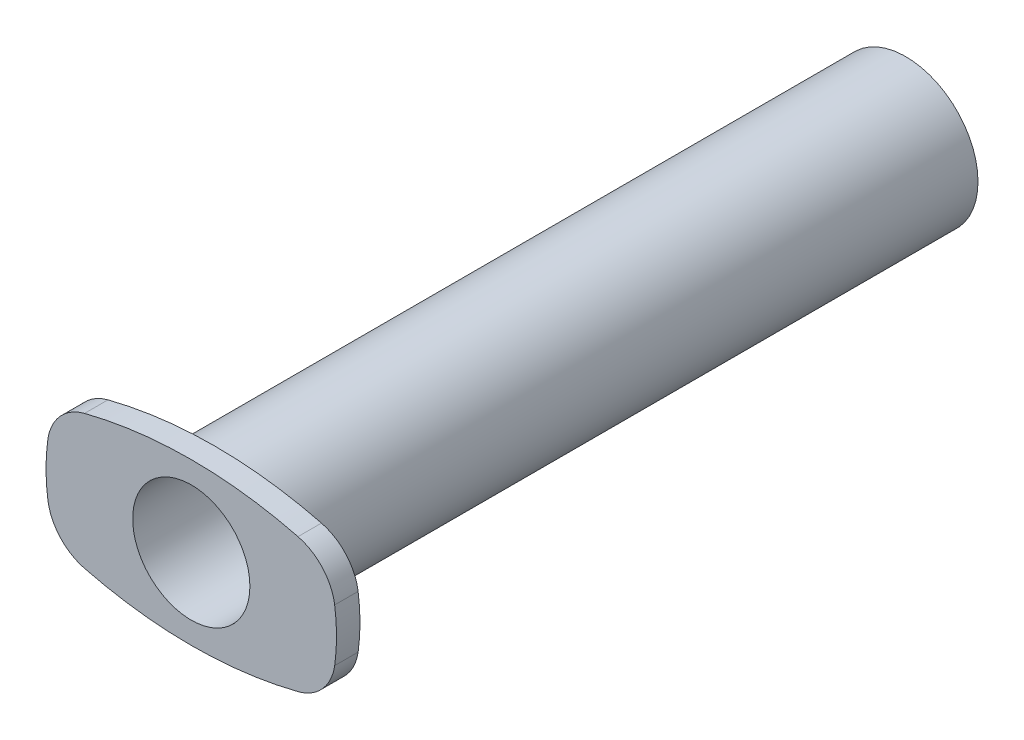
ISO-10303-21;
HEADER;
FILE_DESCRIPTION(('STEP AP214'),'2;1');
FILE_NAME('part.step','',(''),(''),'','','');
FILE_SCHEMA(('AUTOMOTIVE_DESIGN { 1 0 10303 214 1 1 1 1 }'));
ENDSEC;
DATA;
#1=APPLICATION_CONTEXT('core data for automotive mechanical design processes');
#2=APPLICATION_PROTOCOL_DEFINITION('international standard','automotive_design',2000,#1);
#3=PRODUCT_CONTEXT('',#1,'mechanical');
#4=PRODUCT('Part','Part','',(#3));
#5=PRODUCT_RELATED_PRODUCT_CATEGORY('part','',(#4));
#6=PRODUCT_DEFINITION_FORMATION('','',#4);
#7=PRODUCT_DEFINITION_CONTEXT('part definition',#1,'design');
#8=PRODUCT_DEFINITION('design','',#6,#7);
#9=PRODUCT_DEFINITION_SHAPE('','',#8);
#10=(LENGTH_UNIT() NAMED_UNIT(*) SI_UNIT(.MILLI.,.METRE.));
#11=(NAMED_UNIT(*) PLANE_ANGLE_UNIT() SI_UNIT($,.RADIAN.));
#12=(NAMED_UNIT(*) SI_UNIT($,.STERADIAN.) SOLID_ANGLE_UNIT());
#13=UNCERTAINTY_MEASURE_WITH_UNIT(LENGTH_MEASURE(1.E-05),#10,'distance_accuracy_value','');
#14=(GEOMETRIC_REPRESENTATION_CONTEXT(3) GLOBAL_UNCERTAINTY_ASSIGNED_CONTEXT((#13)) GLOBAL_UNIT_ASSIGNED_CONTEXT((#10,
#11,#12)) REPRESENTATION_CONTEXT('',''));
#15=CARTESIAN_POINT('',(0.,0.,0.));
#16=DIRECTION('',(0.,0.,1.));
#17=DIRECTION('',(1.,0.,0.));
#18=AXIS2_PLACEMENT_3D('',#15,#16,#17);
#19=CARTESIAN_POINT('',(0.,0.,-56.));
#20=DIRECTION('',(0.,0.,1.));
#21=DIRECTION('',(1.,0.,0.));
#22=AXIS2_PLACEMENT_3D('',#19,#20,#21);
#23=PLANE('',#22);
#24=CARTESIAN_POINT('',(0.,0.,-56.));
#25=DIRECTION('',(0.,0.,1.));
#26=DIRECTION('',(1.,0.,0.));
#27=AXIS2_PLACEMENT_3D('',#24,#25,#26);
#28=CIRCLE('',#27,4.75);
#29=CARTESIAN_POINT('',(4.75,0.,-56.));
#30=VERTEX_POINT('',#29);
#31=EDGE_CURVE('E18',#30,#30,#28,.T.);
#32=ORIENTED_EDGE('',*,*,#31,.T.);
#33=EDGE_LOOP('',(#32));
#34=FACE_BOUND('',#33,.T.);
#35=CARTESIAN_POINT('',(0.,0.,-56.));
#36=DIRECTION('',(0.,0.,1.));
#37=DIRECTION('',(1.,0.,0.));
#38=AXIS2_PLACEMENT_3D('',#35,#36,#37);
#39=CIRCLE('',#38,5.85);
#40=CARTESIAN_POINT('',(5.85,0.,-56.));
#41=VERTEX_POINT('',#40);
#42=EDGE_CURVE('E44',#41,#41,#39,.T.);
#43=ORIENTED_EDGE('',*,*,#42,.F.);
#44=EDGE_LOOP('',(#43));
#45=FACE_BOUND('',#44,.T.);
#46=ADVANCED_FACE('F15',(#34,#45),#23,.F.);
#47=CARTESIAN_POINT('',(0.,0.,0.));
#48=DIRECTION('',(0.,0.,-1.));
#49=DIRECTION('',(1.,0.,0.));
#50=AXIS2_PLACEMENT_3D('',#47,#48,#49);
#51=CYLINDRICAL_SURFACE('',#50,4.75);
#52=ORIENTED_EDGE('',*,*,#31,.F.);
#53=CARTESIAN_POINT('',(4.75,0.,1.9));
#54=CARTESIAN_POINT('',(4.75,0.,-56.));
#55=(BOUNDED_CURVE() B_SPLINE_CURVE(1,(#53,#54),.UNSPECIFIED.,.F.,
.F.) B_SPLINE_CURVE_WITH_KNOTS((2,2),(-1.9,56.),
.UNSPECIFIED.) CURVE() GEOMETRIC_REPRESENTATION_ITEM() RATIONAL_B_SPLINE_CURVE((1.,1.)) REPRESENTATION_ITEM(''));
#56=CARTESIAN_POINT('',(4.75,0.,1.9));
#57=VERTEX_POINT('',#56);
#58=EDGE_CURVE('E10',#57,#30,#55,.T.);
#59=ORIENTED_EDGE('',*,*,#58,.F.);
#60=CARTESIAN_POINT('',(0.,0.,1.9));
#61=DIRECTION('',(0.,0.,1.));
#62=DIRECTION('',(1.,0.,0.));
#63=AXIS2_PLACEMENT_3D('',#60,#61,#62);
#64=CIRCLE('',#63,4.75);
#65=EDGE_CURVE('E157',#57,#57,#64,.T.);
#66=ORIENTED_EDGE('',*,*,#65,.T.);
#67=ORIENTED_EDGE('',*,*,#58,.T.);
#68=EDGE_LOOP('',(#52,#59,#66,#67));
#69=FACE_BOUND('',#68,.T.);
#70=ADVANCED_FACE('F213',(#69),#51,.F.);
#71=CARTESIAN_POINT('',(0.,0.,0.));
#72=DIRECTION('',(0.,0.,1.));
#73=DIRECTION('',(1.,0.,0.));
#74=AXIS2_PLACEMENT_3D('',#71,#72,#73);
#75=CYLINDRICAL_SURFACE('',#74,5.85);
#76=DIRECTION('',(0.,0.,-1.));
#77=VECTOR('',#76,1.);
#78=CARTESIAN_POINT('',(5.85,0.,0.));
#79=LINE('',#78,#77);
#80=CARTESIAN_POINT('',(5.85,0.,0.));
#81=VERTEX_POINT('',#80);
#82=EDGE_CURVE('E130',#81,#41,#79,.T.);
#83=ORIENTED_EDGE('',*,*,#82,.T.);
#84=ORIENTED_EDGE('',*,*,#42,.T.);
#85=ORIENTED_EDGE('',*,*,#82,.F.);
#86=CARTESIAN_POINT('',(0.,0.,0.));
#87=DIRECTION('',(0.,0.,1.));
#88=DIRECTION('',(1.,0.,0.));
#89=AXIS2_PLACEMENT_3D('',#86,#87,#88);
#90=CIRCLE('',#89,5.85);
#91=EDGE_CURVE('E332',#81,#81,#90,.T.);
#92=ORIENTED_EDGE('',*,*,#91,.F.);
#93=EDGE_LOOP('',(#83,#84,#85,#92));
#94=FACE_BOUND('',#93,.T.);
#95=ADVANCED_FACE('F235',(#94),#75,.T.);
#96=CARTESIAN_POINT('',(0.,28.476495451672,0.));
#97=DIRECTION('',(0.,0.,-1.));
#98=DIRECTION('',(1.,0.,0.));
#99=AXIS2_PLACEMENT_3D('',#96,#97,#98);
#100=CYLINDRICAL_SURFACE('',#99,35.);
#101=CARTESIAN_POINT('',(8.648912649963,-5.438048773089,-0.11628));
#102=CARTESIAN_POINT('',(8.648912649963,-5.438048773089,-0.05814));
#103=CARTESIAN_POINT('',(8.648912649963,-5.438048773089,0.95));
#104=CARTESIAN_POINT('',(8.648912649963,-5.438048773089,1.95814));
#105=CARTESIAN_POINT('',(8.648912649963,-5.438048773089,2.01628));
#106=(BOUNDED_CURVE() B_SPLINE_CURVE(2,(#101,#102,#103,#104,#105),.UNSPECIFIED.,.F.,
.F.) B_SPLINE_CURVE_WITH_KNOTS((3,1,1,3),(-0.11628,0.,1.9,2.01628),
.UNSPECIFIED.) CURVE() GEOMETRIC_REPRESENTATION_ITEM() RATIONAL_B_SPLINE_CURVE((1.,1.,1.,1.,1.)) REPRESENTATION_ITEM(''));
#107=CARTESIAN_POINT('',(8.648912649963,-5.438048773089,0.));
#108=VERTEX_POINT('',#107);
#109=CARTESIAN_POINT('',(8.648912649963,-5.438048773089,1.9));
#110=VERTEX_POINT('',#109);
#111=EDGE_CURVE('E131',#108,#110,#106,.T.);
#112=ORIENTED_EDGE('',*,*,#111,.T.);
#113=CARTESIAN_POINT('',(0.,28.476495451672,1.9));
#114=DIRECTION('',(0.,0.,1.));
#115=DIRECTION('',(1.,0.,0.));
#116=AXIS2_PLACEMENT_3D('',#113,#114,#115);
#117=CIRCLE('',#116,35.);
#118=CARTESIAN_POINT('',(-8.648912649963,-5.438048773089,1.9));
#119=VERTEX_POINT('',#118);
#120=EDGE_CURVE('E134',#119,#110,#117,.T.);
#121=ORIENTED_EDGE('',*,*,#120,.F.);
#122=CARTESIAN_POINT('',(-8.648912649963,-5.438048773089,-0.11628));
#123=CARTESIAN_POINT('',(-8.648912649963,-5.438048773089,-0.05814));
#124=CARTESIAN_POINT('',(-8.648912649963,-5.438048773089,0.95));
#125=CARTESIAN_POINT('',(-8.648912649963,-5.438048773089,1.95814));
#126=CARTESIAN_POINT('',(-8.648912649963,-5.438048773089,2.01628));
#127=(BOUNDED_CURVE() B_SPLINE_CURVE(2,(#122,#123,#124,#125,#126),.UNSPECIFIED.,.F.,
.F.) B_SPLINE_CURVE_WITH_KNOTS((3,1,1,3),(-0.11628,0.,1.9,2.01628),
.UNSPECIFIED.) CURVE() GEOMETRIC_REPRESENTATION_ITEM() RATIONAL_B_SPLINE_CURVE((1.,1.,1.,1.,1.)) REPRESENTATION_ITEM(''));
#128=CARTESIAN_POINT('',(-8.648912649963,-5.438048773089,0.));
#129=VERTEX_POINT('',#128);
#130=EDGE_CURVE('E118',#129,#119,#127,.T.);
#131=ORIENTED_EDGE('',*,*,#130,.F.);
#132=CARTESIAN_POINT('',(0.,28.476495451672,0.));
#133=DIRECTION('',(0.,0.,1.));
#134=DIRECTION('',(1.,0.,0.));
#135=AXIS2_PLACEMENT_3D('',#132,#133,#134);
#136=CIRCLE('',#135,35.);
#137=EDGE_CURVE('E324',#129,#108,#136,.T.);
#138=ORIENTED_EDGE('',*,*,#137,.T.);
#139=EDGE_LOOP('',(#112,#121,#131,#138));
#140=FACE_BOUND('',#139,.T.);
#141=ADVANCED_FACE('F135',(#140),#100,.T.);
#142=CARTESIAN_POINT('',(-11.61992685909,-2.130137538666,-0.11628));
#143=CARTESIAN_POINT('',(-11.61992685909,-2.130137538666,-0.05814));
#144=CARTESIAN_POINT('',(-11.61992685909,-2.130137538666,0.95));
#145=CARTESIAN_POINT('',(-11.61992685909,-2.130137538666,1.95814));
#146=CARTESIAN_POINT('',(-11.61992685909,-2.130137538666,2.01628));
#147=CARTESIAN_POINT('',(-11.2401674326,-4.777225023835,-0.11628));
#148=CARTESIAN_POINT('',(-11.2401674326,-4.777225023835,-0.05814));
#149=CARTESIAN_POINT('',(-11.2401674326,-4.777225023835,0.95));
#150=CARTESIAN_POINT('',(-11.2401674326,-4.777225023835,1.95814));
#151=CARTESIAN_POINT('',(-11.2401674326,-4.777225023835,2.01628));
#152=CARTESIAN_POINT('',(-8.648912649963,-5.438048773089,-0.11628));
#153=CARTESIAN_POINT('',(-8.648912649963,-5.438048773089,-0.05814));
#154=CARTESIAN_POINT('',(-8.648912649963,-5.438048773089,0.95));
#155=CARTESIAN_POINT('',(-8.648912649963,-5.438048773089,1.95814));
#156=CARTESIAN_POINT('',(-8.648912649963,-5.438048773089,2.01628));
#157=(BOUNDED_SURFACE() B_SPLINE_SURFACE(2,2,((#142,#143,#144,#145,#146),(#147,#148,#149,#150,
#151),(#152,#153,#154,#155,#156)),.UNSPECIFIED.,.F.,.F.,.F.) B_SPLINE_SURFACE_WITH_KNOTS((3,3),
(3,1,1,3),(0.,1.9),(-0.11628,0.,1.9,2.01628),
.UNSPECIFIED.) GEOMETRIC_REPRESENTATION_ITEM() RATIONAL_B_SPLINE_SURFACE(((1.,1.,1.,1.,1.),
(0.831327983507,0.831327983507,0.831327983507,0.831327983507,0.831327983507),(1.,1.,1.,1.,1.))) REPRESENTATION_ITEM('') SURFACE());
#158=CARTESIAN_POINT('',(-11.61992685909,-2.130137538666,0.));
#159=CARTESIAN_POINT('',(-11.60073894008,-2.263885634785,0.));
#160=CARTESIAN_POINT('',(-11.57586552164,-2.397088704009,0.));
#161=CARTESIAN_POINT('',(-11.54531265865,-2.529387754868,0.));
#162=CARTESIAN_POINT('',(-11.50912387014,-2.660428908993,0.));
#163=CARTESIAN_POINT('',(-11.43771635617,-2.881841684097,0.));
#164=CARTESIAN_POINT('',(-11.40524733834,-2.973009007382,0.));
#165=CARTESIAN_POINT('',(-11.370002059,-3.063240520996,0.));
#166=CARTESIAN_POINT('',(-11.33201846769,-3.152414232695,0.));
#167=CARTESIAN_POINT('',(-11.19124704767,-3.456960953788,0.));
#168=CARTESIAN_POINT('',(-11.07484769133,-3.666390698714,0.));
#169=CARTESIAN_POINT('',(-10.94285352399,-3.866909104928,0.));
#170=CARTESIAN_POINT('',(-10.7962665271,-4.056897716729,0.));
#171=CARTESIAN_POINT('',(-10.47647724788,-4.412949379528,0.));
#172=CARTESIAN_POINT('',(-10.3032645598,-4.57902401624,0.));
#173=CARTESIAN_POINT('',(-10.1180210641,-4.731716317112,0.));
#174=CARTESIAN_POINT('',(-9.922248710178,-4.869856874701,0.));
#175=CARTESIAN_POINT('',(-9.634513337204,-5.042407311279,0.));
#176=CARTESIAN_POINT('',(-9.54991592655,-5.0897146276,0.));
#177=CARTESIAN_POINT('',(-9.463973781223,-5.134412540542,0.));
#178=CARTESIAN_POINT('',(-9.37680413239,-5.176450264982,0.));
#179=CARTESIAN_POINT('',(-9.164303312305,-5.271139501407,0.));
#180=CARTESIAN_POINT('',(-9.037886781851,-5.321142234495,0.));
#181=CARTESIAN_POINT('',(-8.909616519204,-5.365675997138,0.));
#182=CARTESIAN_POINT('',(-8.779839714399,-5.404659654359,0.));
#183=CARTESIAN_POINT('',(-8.648912649963,-5.438048773089,0.));
#184=(BOUNDED_CURVE() B_SPLINE_CURVE(5,(#158,#159,#160,#161,#162,#163,#164,#165,#166,#167,#168,
#169,#170,#171,#172,#173,#174,#175,#176,#177,#178,#179,#180,#181,#182,#183),.UNSPECIFIED.,.F.,
.F.) B_SPLINE_CURVE_WITH_KNOTS((6,4,4,4,4,4,6),(0.,0.144535325046,0.247244508741,0.5,
0.752755491259,0.855464674954,1.),
.UNSPECIFIED.) CURVE() GEOMETRIC_REPRESENTATION_ITEM() RATIONAL_B_SPLINE_CURVE((1.,1.,1.,1.,1.,
1.,1.,1.,1.,1.,1.,1.,1.,1.,1.,1.,1.,1.,1.,1.,1.,1.,1.,1.,1.,1.)) REPRESENTATION_ITEM(''));
#185=CARTESIAN_POINT('',(-11.61992685909,-2.130137538666,0.));
#186=VERTEX_POINT('',#185);
#187=EDGE_CURVE('E125',#186,#129,#184,.T.);
#188=CARTESIAN_POINT('',(-11.61992685909,-2.130137538666,1.9));
#189=CARTESIAN_POINT('',(-11.60073894008,-2.263885634785,1.9));
#190=CARTESIAN_POINT('',(-11.57586552164,-2.397088704009,1.9));
#191=CARTESIAN_POINT('',(-11.54531265865,-2.529387754868,1.9));
#192=CARTESIAN_POINT('',(-11.50912387014,-2.660428908993,1.9));
#193=CARTESIAN_POINT('',(-11.43771635617,-2.881841684097,1.9));
#194=CARTESIAN_POINT('',(-11.40524733834,-2.973009007382,1.9));
#195=CARTESIAN_POINT('',(-11.370002059,-3.063240520996,1.9));
#196=CARTESIAN_POINT('',(-11.33201846769,-3.152414232695,1.9));
#197=CARTESIAN_POINT('',(-11.19124704767,-3.456960953788,1.9));
#198=CARTESIAN_POINT('',(-11.07484769133,-3.666390698714,1.9));
#199=CARTESIAN_POINT('',(-10.94285352399,-3.866909104928,1.9));
#200=CARTESIAN_POINT('',(-10.7962665271,-4.056897716729,1.9));
#201=CARTESIAN_POINT('',(-10.47647724788,-4.412949379528,1.9));
#202=CARTESIAN_POINT('',(-10.3032645598,-4.57902401624,1.9));
#203=CARTESIAN_POINT('',(-10.1180210641,-4.731716317112,1.9));
#204=CARTESIAN_POINT('',(-9.922248710178,-4.869856874701,1.9));
#205=CARTESIAN_POINT('',(-9.634513337204,-5.042407311279,1.9));
#206=CARTESIAN_POINT('',(-9.54991592655,-5.0897146276,1.9));
#207=CARTESIAN_POINT('',(-9.463973781223,-5.134412540542,1.9));
#208=CARTESIAN_POINT('',(-9.37680413239,-5.176450264982,1.9));
#209=CARTESIAN_POINT('',(-9.164303312305,-5.271139501407,1.9));
#210=CARTESIAN_POINT('',(-9.037886781851,-5.321142234495,1.9));
#211=CARTESIAN_POINT('',(-8.909616519204,-5.365675997138,1.9));
#212=CARTESIAN_POINT('',(-8.779839714399,-5.404659654359,1.9));
#213=CARTESIAN_POINT('',(-8.648912649963,-5.438048773089,1.9));
#214=(BOUNDED_CURVE() B_SPLINE_CURVE(5,(#188,#189,#190,#191,#192,#193,#194,#195,#196,#197,#198,
#199,#200,#201,#202,#203,#204,#205,#206,#207,#208,#209,#210,#211,#212,#213),.UNSPECIFIED.,.F.,
.F.) B_SPLINE_CURVE_WITH_KNOTS((6,4,4,4,4,4,6),(0.,0.144535325046,0.247244508741,0.5,
0.752755491259,0.855464674954,1.),
.UNSPECIFIED.) CURVE() GEOMETRIC_REPRESENTATION_ITEM() RATIONAL_B_SPLINE_CURVE((1.,1.,1.,1.,1.,
1.,1.,1.,1.,1.,1.,1.,1.,1.,1.,1.,1.,1.,1.,1.,1.,1.,1.,1.,1.,1.)) REPRESENTATION_ITEM(''));
#215=CARTESIAN_POINT('',(-11.61992685909,-2.130137538666,1.9));
#216=VERTEX_POINT('',#215);
#217=EDGE_CURVE('E122',#216,#119,#214,.T.);
#218=CARTESIAN_POINT('',(-11.61992685909,-2.130137538666,-0.11628));
#219=CARTESIAN_POINT('',(-11.61992685909,-2.130137538666,-0.05814));
#220=CARTESIAN_POINT('',(-11.61992685909,-2.130137538666,0.95));
#221=CARTESIAN_POINT('',(-11.61992685909,-2.130137538666,1.95814));
#222=CARTESIAN_POINT('',(-11.61992685909,-2.130137538666,2.01628));
#223=(BOUNDED_CURVE() B_SPLINE_CURVE(2,(#218,#219,#220,#221,#222),.UNSPECIFIED.,.F.,
.F.) B_SPLINE_CURVE_WITH_KNOTS((3,1,1,3),(-0.11628,0.,1.9,2.01628),
.UNSPECIFIED.) CURVE() GEOMETRIC_REPRESENTATION_ITEM() RATIONAL_B_SPLINE_CURVE((1.,1.,1.,1.,1.)) REPRESENTATION_ITEM(''));
#224=EDGE_CURVE('E177',#186,#216,#223,.T.);
#225=ORIENTED_EDGE('',*,*,#187,.T.);
#226=ORIENTED_EDGE('',*,*,#130,.T.);
#227=ORIENTED_EDGE('',*,*,#217,.F.);
#228=ORIENTED_EDGE('',*,*,#224,.F.);
#229=EDGE_LOOP('',(#225,#226,#227,#228));
#230=FACE_BOUND('',#229,.T.);
#231=ADVANCED_FACE('F120',(#230),#157,.T.);
#232=CARTESIAN_POINT('',(11.619926859094,-2.130137538666,-0.11628));
#233=CARTESIAN_POINT('',(11.619926859094,-2.130137538666,-0.05814));
#234=CARTESIAN_POINT('',(11.619926859094,-2.130137538666,0.95));
#235=CARTESIAN_POINT('',(11.619926859094,-2.130137538666,1.95814));
#236=CARTESIAN_POINT('',(11.619926859094,-2.130137538666,2.01628));
#237=CARTESIAN_POINT('',(11.240167432605,-4.777225023835,-0.11628));
#238=CARTESIAN_POINT('',(11.240167432605,-4.777225023835,-0.05814));
#239=CARTESIAN_POINT('',(11.240167432605,-4.777225023835,0.95));
#240=CARTESIAN_POINT('',(11.240167432605,-4.777225023835,1.95814));
#241=CARTESIAN_POINT('',(11.240167432605,-4.777225023835,2.01628));
#242=CARTESIAN_POINT('',(8.648912649963,-5.438048773089,-0.11628));
#243=CARTESIAN_POINT('',(8.648912649963,-5.438048773089,-0.05814));
#244=CARTESIAN_POINT('',(8.648912649963,-5.438048773089,0.95));
#245=CARTESIAN_POINT('',(8.648912649963,-5.438048773089,1.95814));
#246=CARTESIAN_POINT('',(8.648912649963,-5.438048773089,2.01628));
#247=(BOUNDED_SURFACE() B_SPLINE_SURFACE(2,2,((#232,#233,#234,#235,#236),(#237,#238,#239,#240,
#241),(#242,#243,#244,#245,#246)),.UNSPECIFIED.,.F.,.F.,.F.) B_SPLINE_SURFACE_WITH_KNOTS((3,3),
(3,1,1,3),(0.,1.9),(-0.11628,0.,1.9,2.01628),
.UNSPECIFIED.) GEOMETRIC_REPRESENTATION_ITEM() RATIONAL_B_SPLINE_SURFACE(((1.,1.,1.,1.,1.),
(0.831327983507,0.831327983507,0.831327983507,0.831327983507,0.831327983507),(1.,1.,1.,1.,1.))) REPRESENTATION_ITEM('') SURFACE());
#248=CARTESIAN_POINT('',(11.619926859094,-2.130137538666,-0.11628));
#249=CARTESIAN_POINT('',(11.619926859094,-2.130137538666,-0.05814));
#250=CARTESIAN_POINT('',(11.619926859094,-2.130137538666,0.95));
#251=CARTESIAN_POINT('',(11.619926859094,-2.130137538666,1.95814));
#252=CARTESIAN_POINT('',(11.619926859094,-2.130137538666,2.01628));
#253=(BOUNDED_CURVE() B_SPLINE_CURVE(2,(#248,#249,#250,#251,#252),.UNSPECIFIED.,.F.,
.F.) B_SPLINE_CURVE_WITH_KNOTS((3,1,1,3),(-0.11628,0.,1.9,2.01628),
.UNSPECIFIED.) CURVE() GEOMETRIC_REPRESENTATION_ITEM() RATIONAL_B_SPLINE_CURVE((1.,1.,1.,1.,1.)) REPRESENTATION_ITEM(''));
#254=CARTESIAN_POINT('',(11.619926859094,-2.130137538666,0.));
#255=VERTEX_POINT('',#254);
#256=CARTESIAN_POINT('',(11.619926859094,-2.130137538666,1.9));
#257=VERTEX_POINT('',#256);
#258=EDGE_CURVE('E161',#255,#257,#253,.T.);
#259=CARTESIAN_POINT('',(11.619926859094,-2.130137538666,1.9));
#260=CARTESIAN_POINT('',(11.600738940084,-2.263885634785,1.9));
#261=CARTESIAN_POINT('',(11.575865521641,-2.397088704009,1.9));
#262=CARTESIAN_POINT('',(11.545312658658,-2.529387754868,1.9));
#263=CARTESIAN_POINT('',(11.509123870146,-2.660428908993,1.9));
#264=CARTESIAN_POINT('',(11.43771635617,-2.881841684097,1.9));
#265=CARTESIAN_POINT('',(11.405247338342,-2.973009007382,1.9));
#266=CARTESIAN_POINT('',(11.370002059002,-3.063240520996,1.9));
#267=CARTESIAN_POINT('',(11.332018467693,-3.152414232695,1.9));
#268=CARTESIAN_POINT('',(11.19124704767,-3.456960953788,1.9));
#269=CARTESIAN_POINT('',(11.074847691338,-3.666390698714,1.9));
#270=CARTESIAN_POINT('',(10.942853523992,-3.866909104928,1.9));
#271=CARTESIAN_POINT('',(10.796266527102,-4.056897716729,1.9));
#272=CARTESIAN_POINT('',(10.476477247888,-4.412949379529,1.9));
#273=CARTESIAN_POINT('',(10.303264559806,-4.57902401624,1.9));
#274=CARTESIAN_POINT('',(10.118021064108,-4.731716317112,1.9));
#275=CARTESIAN_POINT('',(9.922248710178,-4.869856874701,1.9));
#276=CARTESIAN_POINT('',(9.634513337204,-5.042407311279,1.9));
#277=CARTESIAN_POINT('',(9.54991592655,-5.0897146276,1.9));
#278=CARTESIAN_POINT('',(9.463973781223,-5.134412540542,1.9));
#279=CARTESIAN_POINT('',(9.37680413239,-5.176450264982,1.9));
#280=CARTESIAN_POINT('',(9.164303312305,-5.271139501407,1.9));
#281=CARTESIAN_POINT('',(9.037886781851,-5.321142234495,1.9));
#282=CARTESIAN_POINT('',(8.909616519204,-5.365675997138,1.9));
#283=CARTESIAN_POINT('',(8.779839714399,-5.404659654359,1.9));
#284=CARTESIAN_POINT('',(8.648912649963,-5.438048773089,1.9));
#285=(BOUNDED_CURVE() B_SPLINE_CURVE(5,(#259,#260,#261,#262,#263,#264,#265,#266,#267,#268,#269,
#270,#271,#272,#273,#274,#275,#276,#277,#278,#279,#280,#281,#282,#283,#284),.UNSPECIFIED.,.F.,
.F.) B_SPLINE_CURVE_WITH_KNOTS((6,4,4,4,4,4,6),(0.,0.144535325046,0.247244508741,0.5,
0.752755491259,0.855464674954,1.),
.UNSPECIFIED.) CURVE() GEOMETRIC_REPRESENTATION_ITEM() RATIONAL_B_SPLINE_CURVE((1.,1.,1.,1.,1.,
1.,1.,1.,1.,1.,1.,1.,1.,1.,1.,1.,1.,1.,1.,1.,1.,1.,1.,1.,1.,1.)) REPRESENTATION_ITEM(''));
#286=EDGE_CURVE('E140',#257,#110,#285,.T.);
#287=CARTESIAN_POINT('',(11.619926859094,-2.130137538666,0.));
#288=CARTESIAN_POINT('',(11.600738940084,-2.263885634785,0.));
#289=CARTESIAN_POINT('',(11.575865521641,-2.397088704009,0.));
#290=CARTESIAN_POINT('',(11.545312658658,-2.529387754868,0.));
#291=CARTESIAN_POINT('',(11.509123870146,-2.660428908993,0.));
#292=CARTESIAN_POINT('',(11.43771635617,-2.881841684097,0.));
#293=CARTESIAN_POINT('',(11.405247338342,-2.973009007382,0.));
#294=CARTESIAN_POINT('',(11.370002059002,-3.063240520996,0.));
#295=CARTESIAN_POINT('',(11.332018467693,-3.152414232695,0.));
#296=CARTESIAN_POINT('',(11.19124704767,-3.456960953788,0.));
#297=CARTESIAN_POINT('',(11.074847691338,-3.666390698714,0.));
#298=CARTESIAN_POINT('',(10.942853523992,-3.866909104928,0.));
#299=CARTESIAN_POINT('',(10.796266527102,-4.056897716729,0.));
#300=CARTESIAN_POINT('',(10.476477247888,-4.412949379529,0.));
#301=CARTESIAN_POINT('',(10.303264559806,-4.57902401624,0.));
#302=CARTESIAN_POINT('',(10.118021064108,-4.731716317112,0.));
#303=CARTESIAN_POINT('',(9.922248710178,-4.869856874701,0.));
#304=CARTESIAN_POINT('',(9.634513337204,-5.042407311279,0.));
#305=CARTESIAN_POINT('',(9.54991592655,-5.0897146276,0.));
#306=CARTESIAN_POINT('',(9.463973781223,-5.134412540542,0.));
#307=CARTESIAN_POINT('',(9.37680413239,-5.176450264982,0.));
#308=CARTESIAN_POINT('',(9.164303312305,-5.271139501407,0.));
#309=CARTESIAN_POINT('',(9.037886781851,-5.321142234495,0.));
#310=CARTESIAN_POINT('',(8.909616519204,-5.365675997138,0.));
#311=CARTESIAN_POINT('',(8.779839714399,-5.404659654359,0.));
#312=CARTESIAN_POINT('',(8.648912649963,-5.438048773089,0.));
#313=(BOUNDED_CURVE() B_SPLINE_CURVE(5,(#287,#288,#289,#290,#291,#292,#293,#294,#295,#296,#297,
#298,#299,#300,#301,#302,#303,#304,#305,#306,#307,#308,#309,#310,#311,#312),.UNSPECIFIED.,.F.,
.F.) B_SPLINE_CURVE_WITH_KNOTS((6,4,4,4,4,4,6),(0.,0.144535325046,0.247244508741,0.5,
0.752755491259,0.855464674954,1.),
.UNSPECIFIED.) CURVE() GEOMETRIC_REPRESENTATION_ITEM() RATIONAL_B_SPLINE_CURVE((1.,1.,1.,1.,1.,
1.,1.,1.,1.,1.,1.,1.,1.,1.,1.,1.,1.,1.,1.,1.,1.,1.,1.,1.,1.,1.)) REPRESENTATION_ITEM(''));
#314=EDGE_CURVE('E311',#255,#108,#313,.T.);
#315=ORIENTED_EDGE('',*,*,#258,.T.);
#316=ORIENTED_EDGE('',*,*,#286,.T.);
#317=ORIENTED_EDGE('',*,*,#111,.F.);
#318=ORIENTED_EDGE('',*,*,#314,.F.);
#319=EDGE_LOOP('',(#315,#316,#317,#318));
#320=FACE_BOUND('',#319,.T.);
#321=ADVANCED_FACE('F387',(#320),#247,.F.);
#322=CARTESIAN_POINT('',(3.228053275132,0.,0.));
#323=DIRECTION('',(0.,0.,-1.));
#324=DIRECTION('',(1.,0.,0.));
#325=AXIS2_PLACEMENT_3D('',#322,#323,#324);
#326=CYLINDRICAL_SURFACE('',#325,15.);
#327=ORIENTED_EDGE('',*,*,#224,.T.);
#328=CARTESIAN_POINT('',(3.228053275132,0.,1.9));
#329=DIRECTION('',(0.,0.,1.));
#330=DIRECTION('',(1.,0.,0.));
#331=AXIS2_PLACEMENT_3D('',#328,#329,#330);
#332=CIRCLE('',#331,15.);
#333=CARTESIAN_POINT('',(-11.61992685909,2.130137538666,1.9));
#334=VERTEX_POINT('',#333);
#335=EDGE_CURVE('E145',#334,#216,#332,.T.);
#336=ORIENTED_EDGE('',*,*,#335,.F.);
#337=CARTESIAN_POINT('',(-11.61992685909,2.130137538666,-0.11628));
#338=CARTESIAN_POINT('',(-11.61992685909,2.130137538666,-0.05814));
#339=CARTESIAN_POINT('',(-11.61992685909,2.130137538666,0.95));
#340=CARTESIAN_POINT('',(-11.61992685909,2.130137538666,1.95814));
#341=CARTESIAN_POINT('',(-11.61992685909,2.130137538666,2.01628));
#342=(BOUNDED_CURVE() B_SPLINE_CURVE(2,(#337,#338,#339,#340,#341),.UNSPECIFIED.,.F.,
.F.) B_SPLINE_CURVE_WITH_KNOTS((3,1,1,3),(-0.11628,0.,1.9,2.01628),
.UNSPECIFIED.) CURVE() GEOMETRIC_REPRESENTATION_ITEM() RATIONAL_B_SPLINE_CURVE((1.,1.,1.,1.,1.)) REPRESENTATION_ITEM(''));
#343=CARTESIAN_POINT('',(-11.61992685909,2.130137538666,0.));
#344=VERTEX_POINT('',#343);
#345=EDGE_CURVE('E356',#344,#334,#342,.T.);
#346=ORIENTED_EDGE('',*,*,#345,.F.);
#347=CARTESIAN_POINT('',(3.228053275132,0.,0.));
#348=DIRECTION('',(0.,0.,1.));
#349=DIRECTION('',(1.,0.,0.));
#350=AXIS2_PLACEMENT_3D('',#347,#348,#349);
#351=CIRCLE('',#350,15.);
#352=EDGE_CURVE('E296',#344,#186,#351,.T.);
#353=ORIENTED_EDGE('',*,*,#352,.T.);
#354=EDGE_LOOP('',(#327,#336,#346,#353));
#355=FACE_BOUND('',#354,.T.);
#356=ADVANCED_FACE('F228',(#355),#326,.T.);
#357=CARTESIAN_POINT('',(-3.228053275132,0.,0.));
#358=DIRECTION('',(0.,0.,-1.));
#359=DIRECTION('',(1.,0.,0.));
#360=AXIS2_PLACEMENT_3D('',#357,#358,#359);
#361=CYLINDRICAL_SURFACE('',#360,15.);
#362=CARTESIAN_POINT('',(11.619926859094,2.130137538666,-0.11628));
#363=CARTESIAN_POINT('',(11.619926859094,2.130137538666,-0.05814));
#364=CARTESIAN_POINT('',(11.619926859094,2.130137538666,0.95));
#365=CARTESIAN_POINT('',(11.619926859094,2.130137538666,1.95814));
#366=CARTESIAN_POINT('',(11.619926859094,2.130137538666,2.01628));
#367=(BOUNDED_CURVE() B_SPLINE_CURVE(2,(#362,#363,#364,#365,#366),.UNSPECIFIED.,.F.,
.F.) B_SPLINE_CURVE_WITH_KNOTS((3,1,1,3),(-0.11628,0.,1.9,2.01628),
.UNSPECIFIED.) CURVE() GEOMETRIC_REPRESENTATION_ITEM() RATIONAL_B_SPLINE_CURVE((1.,1.,1.,1.,1.)) REPRESENTATION_ITEM(''));
#368=CARTESIAN_POINT('',(11.619926859094,2.130137538666,0.));
#369=VERTEX_POINT('',#368);
#370=CARTESIAN_POINT('',(11.619926859094,2.130137538666,1.9));
#371=VERTEX_POINT('',#370);
#372=EDGE_CURVE('E293',#369,#371,#367,.T.);
#373=ORIENTED_EDGE('',*,*,#372,.T.);
#374=CARTESIAN_POINT('',(-3.228053275132,0.,1.9));
#375=DIRECTION('',(0.,0.,1.));
#376=DIRECTION('',(1.,0.,0.));
#377=AXIS2_PLACEMENT_3D('',#374,#375,#376);
#378=CIRCLE('',#377,15.);
#379=EDGE_CURVE('E162',#257,#371,#378,.T.);
#380=ORIENTED_EDGE('',*,*,#379,.F.);
#381=ORIENTED_EDGE('',*,*,#258,.F.);
#382=CARTESIAN_POINT('',(-3.228053275132,0.,0.));
#383=DIRECTION('',(0.,0.,1.));
#384=DIRECTION('',(1.,0.,0.));
#385=AXIS2_PLACEMENT_3D('',#382,#383,#384);
#386=CIRCLE('',#385,15.);
#387=EDGE_CURVE('E304',#255,#369,#386,.T.);
#388=ORIENTED_EDGE('',*,*,#387,.T.);
#389=EDGE_LOOP('',(#373,#380,#381,#388));
#390=FACE_BOUND('',#389,.T.);
#391=ADVANCED_FACE('F218',(#390),#361,.T.);
#392=CARTESIAN_POINT('',(0.,0.,1.9));
#393=DIRECTION('',(0.,0.,1.));
#394=DIRECTION('',(1.,0.,0.));
#395=AXIS2_PLACEMENT_3D('',#392,#393,#394);
#396=PLANE('',#395);
#397=ORIENTED_EDGE('',*,*,#65,.F.);
#398=EDGE_LOOP('',(#397));
#399=FACE_BOUND('',#398,.T.);
#400=CARTESIAN_POINT('',(0.,-28.47649545167,1.9));
#401=DIRECTION('',(0.,0.,1.));
#402=DIRECTION('',(1.,0.,0.));
#403=AXIS2_PLACEMENT_3D('',#400,#401,#402);
#404=CIRCLE('',#403,35.);
#405=CARTESIAN_POINT('',(8.648912649963,5.438048773089,1.9));
#406=VERTEX_POINT('',#405);
#407=CARTESIAN_POINT('',(-8.648912649963,5.438048773089,1.9));
#408=VERTEX_POINT('',#407);
#409=EDGE_CURVE('E279',#406,#408,#404,.T.);
#410=ORIENTED_EDGE('',*,*,#409,.T.);
#411=CARTESIAN_POINT('',(-8.648912649963,5.438048773089,1.9));
#412=CARTESIAN_POINT('',(-8.779839714399,5.404659654359,1.9));
#413=CARTESIAN_POINT('',(-8.909616519204,5.365675997138,1.9));
#414=CARTESIAN_POINT('',(-9.037886781851,5.321142234495,1.9));
#415=CARTESIAN_POINT('',(-9.164303312305,5.271139501407,1.9));
#416=CARTESIAN_POINT('',(-9.37680413239,5.176450264982,1.9));
#417=CARTESIAN_POINT('',(-9.463973781223,5.134412540542,1.9));
#418=CARTESIAN_POINT('',(-9.54991592655,5.0897146276,1.9));
#419=CARTESIAN_POINT('',(-9.634513337204,5.042407311279,1.9));
#420=CARTESIAN_POINT('',(-9.922248710178,4.869856874701,1.9));
#421=CARTESIAN_POINT('',(-10.1180210641,4.731716317112,1.9));
#422=CARTESIAN_POINT('',(-10.3032645598,4.57902401624,1.9));
#423=CARTESIAN_POINT('',(-10.47647724788,4.412949379529,1.9));
#424=CARTESIAN_POINT('',(-10.7962665271,4.056897716729,1.9));
#425=CARTESIAN_POINT('',(-10.94285352399,3.866909104928,1.9));
#426=CARTESIAN_POINT('',(-11.07484769133,3.666390698714,1.9));
#427=CARTESIAN_POINT('',(-11.19124704767,3.456960953788,1.9));
#428=CARTESIAN_POINT('',(-11.33201846769,3.152414232695,1.9));
#429=CARTESIAN_POINT('',(-11.370002059,3.063240520996,1.9));
#430=CARTESIAN_POINT('',(-11.40524733834,2.973009007382,1.9));
#431=CARTESIAN_POINT('',(-11.43771635617,2.881841684097,1.9));
#432=CARTESIAN_POINT('',(-11.50912387014,2.660428908993,1.9));
#433=CARTESIAN_POINT('',(-11.54531265865,2.529387754868,1.9));
#434=CARTESIAN_POINT('',(-11.57586552164,2.397088704009,1.9));
#435=CARTESIAN_POINT('',(-11.60073894008,2.263885634785,1.9));
#436=CARTESIAN_POINT('',(-11.61992685909,2.130137538666,1.9));
#437=(BOUNDED_CURVE() B_SPLINE_CURVE(5,(#411,#412,#413,#414,#415,#416,#417,#418,#419,#420,#421,
#422,#423,#424,#425,#426,#427,#428,#429,#430,#431,#432,#433,#434,#435,#436),.UNSPECIFIED.,.F.,
.F.) B_SPLINE_CURVE_WITH_KNOTS((6,4,4,4,4,4,6),(0.,0.144535325046,0.247244508741,0.5,
0.752755491259,0.855464674954,1.),
.UNSPECIFIED.) CURVE() GEOMETRIC_REPRESENTATION_ITEM() RATIONAL_B_SPLINE_CURVE((1.,1.,1.,1.,1.,
1.,1.,1.,1.,1.,1.,1.,1.,1.,1.,1.,1.,1.,1.,1.,1.,1.,1.,1.,1.,1.)) REPRESENTATION_ITEM(''));
#438=EDGE_CURVE('E151',#408,#334,#437,.T.);
#439=ORIENTED_EDGE('',*,*,#438,.T.);
#440=ORIENTED_EDGE('',*,*,#335,.T.);
#441=ORIENTED_EDGE('',*,*,#217,.T.);
#442=ORIENTED_EDGE('',*,*,#120,.T.);
#443=ORIENTED_EDGE('',*,*,#286,.F.);
#444=ORIENTED_EDGE('',*,*,#379,.T.);
#445=CARTESIAN_POINT('',(8.648912649963,5.438048773089,1.9));
#446=CARTESIAN_POINT('',(8.779839714399,5.404659654359,1.9));
#447=CARTESIAN_POINT('',(8.909616519204,5.365675997138,1.9));
#448=CARTESIAN_POINT('',(9.037886781851,5.321142234495,1.9));
#449=CARTESIAN_POINT('',(9.164303312305,5.271139501407,1.9));
#450=CARTESIAN_POINT('',(9.37680413239,5.176450264982,1.9));
#451=CARTESIAN_POINT('',(9.463973781223,5.134412540542,1.9));
#452=CARTESIAN_POINT('',(9.54991592655,5.0897146276,1.9));
#453=CARTESIAN_POINT('',(9.634513337204,5.042407311279,1.9));
#454=CARTESIAN_POINT('',(9.922248710178,4.869856874701,1.9));
#455=CARTESIAN_POINT('',(10.118021064108,4.731716317112,1.9));
#456=CARTESIAN_POINT('',(10.303264559806,4.57902401624,1.9));
#457=CARTESIAN_POINT('',(10.476477247888,4.412949379529,1.9));
#458=CARTESIAN_POINT('',(10.796266527102,4.056897716729,1.9));
#459=CARTESIAN_POINT('',(10.942853523992,3.866909104928,1.9));
#460=CARTESIAN_POINT('',(11.074847691338,3.666390698714,1.9));
#461=CARTESIAN_POINT('',(11.19124704767,3.456960953788,1.9));
#462=CARTESIAN_POINT('',(11.332018467693,3.152414232695,1.9));
#463=CARTESIAN_POINT('',(11.370002059002,3.063240520996,1.9));
#464=CARTESIAN_POINT('',(11.405247338342,2.973009007382,1.9));
#465=CARTESIAN_POINT('',(11.43771635617,2.881841684097,1.9));
#466=CARTESIAN_POINT('',(11.509123870146,2.660428908993,1.9));
#467=CARTESIAN_POINT('',(11.545312658658,2.529387754868,1.9));
#468=CARTESIAN_POINT('',(11.575865521641,2.397088704009,1.9));
#469=CARTESIAN_POINT('',(11.600738940084,2.263885634785,1.9));
#470=CARTESIAN_POINT('',(11.619926859094,2.130137538666,1.9));
#471=(BOUNDED_CURVE() B_SPLINE_CURVE(5,(#445,#446,#447,#448,#449,#450,#451,#452,#453,#454,#455,
#456,#457,#458,#459,#460,#461,#462,#463,#464,#465,#466,#467,#468,#469,#470),.UNSPECIFIED.,.F.,
.F.) B_SPLINE_CURVE_WITH_KNOTS((6,4,4,4,4,4,6),(0.,0.144535325046,0.247244508741,0.5,
0.752755491259,0.855464674954,1.),
.UNSPECIFIED.) CURVE() GEOMETRIC_REPRESENTATION_ITEM() RATIONAL_B_SPLINE_CURVE((1.,1.,1.,1.,1.,
1.,1.,1.,1.,1.,1.,1.,1.,1.,1.,1.,1.,1.,1.,1.,1.,1.,1.,1.,1.,1.)) REPRESENTATION_ITEM(''));
#472=EDGE_CURVE('E271',#406,#371,#471,.T.);
#473=ORIENTED_EDGE('',*,*,#472,.F.);
#474=EDGE_LOOP('',(#410,#439,#440,#441,#442,#443,#444,#473));
#475=FACE_BOUND('',#474,.T.);
#476=ADVANCED_FACE('F143',(#399,#475),#396,.T.);
#477=CARTESIAN_POINT('',(-8.648912649963,5.438048773089,-0.11628));
#478=CARTESIAN_POINT('',(-8.648912649963,5.438048773089,-0.05814));
#479=CARTESIAN_POINT('',(-8.648912649963,5.438048773089,0.95));
#480=CARTESIAN_POINT('',(-8.648912649963,5.438048773089,1.95814));
#481=CARTESIAN_POINT('',(-8.648912649963,5.438048773089,2.01628));
#482=CARTESIAN_POINT('',(-11.2401674326,4.777225023835,-0.11628));
#483=CARTESIAN_POINT('',(-11.2401674326,4.777225023835,-0.05814));
#484=CARTESIAN_POINT('',(-11.2401674326,4.777225023835,0.95));
#485=CARTESIAN_POINT('',(-11.2401674326,4.777225023835,1.95814));
#486=CARTESIAN_POINT('',(-11.2401674326,4.777225023835,2.01628));
#487=CARTESIAN_POINT('',(-11.61992685909,2.130137538666,-0.11628));
#488=CARTESIAN_POINT('',(-11.61992685909,2.130137538666,-0.05814));
#489=CARTESIAN_POINT('',(-11.61992685909,2.130137538666,0.95));
#490=CARTESIAN_POINT('',(-11.61992685909,2.130137538666,1.95814));
#491=CARTESIAN_POINT('',(-11.61992685909,2.130137538666,2.01628));
#492=(BOUNDED_SURFACE() B_SPLINE_SURFACE(2,2,((#477,#478,#479,#480,#481),(#482,#483,#484,#485,
#486),(#487,#488,#489,#490,#491)),.UNSPECIFIED.,.F.,.F.,.F.) B_SPLINE_SURFACE_WITH_KNOTS((3,3),
(3,1,1,3),(0.,1.9),(-0.11628,0.,1.9,2.01628),
.UNSPECIFIED.) GEOMETRIC_REPRESENTATION_ITEM() RATIONAL_B_SPLINE_SURFACE(((1.,1.,1.,1.,1.),
(0.831327983507,0.831327983507,0.831327983507,0.831327983507,0.831327983507),(1.,1.,1.,1.,1.))) REPRESENTATION_ITEM('') SURFACE());
#493=CARTESIAN_POINT('',(-8.648912649963,5.438048773089,0.));
#494=CARTESIAN_POINT('',(-8.779839714399,5.404659654359,0.));
#495=CARTESIAN_POINT('',(-8.909616519204,5.365675997138,0.));
#496=CARTESIAN_POINT('',(-9.037886781851,5.321142234495,0.));
#497=CARTESIAN_POINT('',(-9.164303312305,5.271139501407,0.));
#498=CARTESIAN_POINT('',(-9.37680413239,5.176450264982,0.));
#499=CARTESIAN_POINT('',(-9.463973781223,5.134412540542,0.));
#500=CARTESIAN_POINT('',(-9.54991592655,5.0897146276,0.));
#501=CARTESIAN_POINT('',(-9.634513337204,5.042407311279,0.));
#502=CARTESIAN_POINT('',(-9.922248710178,4.869856874701,0.));
#503=CARTESIAN_POINT('',(-10.1180210641,4.731716317112,0.));
#504=CARTESIAN_POINT('',(-10.3032645598,4.57902401624,0.));
#505=CARTESIAN_POINT('',(-10.47647724788,4.412949379529,0.));
#506=CARTESIAN_POINT('',(-10.7962665271,4.056897716729,0.));
#507=CARTESIAN_POINT('',(-10.94285352399,3.866909104928,0.));
#508=CARTESIAN_POINT('',(-11.07484769133,3.666390698714,0.));
#509=CARTESIAN_POINT('',(-11.19124704767,3.456960953788,0.));
#510=CARTESIAN_POINT('',(-11.33201846769,3.152414232695,0.));
#511=CARTESIAN_POINT('',(-11.370002059,3.063240520996,0.));
#512=CARTESIAN_POINT('',(-11.40524733834,2.973009007382,0.));
#513=CARTESIAN_POINT('',(-11.43771635617,2.881841684097,0.));
#514=CARTESIAN_POINT('',(-11.50912387014,2.660428908993,0.));
#515=CARTESIAN_POINT('',(-11.54531265865,2.529387754868,0.));
#516=CARTESIAN_POINT('',(-11.57586552164,2.397088704009,0.));
#517=CARTESIAN_POINT('',(-11.60073894008,2.263885634785,0.));
#518=CARTESIAN_POINT('',(-11.61992685909,2.130137538666,0.));
#519=(BOUNDED_CURVE() B_SPLINE_CURVE(5,(#493,#494,#495,#496,#497,#498,#499,#500,#501,#502,#503,
#504,#505,#506,#507,#508,#509,#510,#511,#512,#513,#514,#515,#516,#517,#518),.UNSPECIFIED.,.F.,
.F.) B_SPLINE_CURVE_WITH_KNOTS((6,4,4,4,4,4,6),(0.,0.144535325046,0.247244508741,0.5,
0.752755491259,0.855464674954,1.),
.UNSPECIFIED.) CURVE() GEOMETRIC_REPRESENTATION_ITEM() RATIONAL_B_SPLINE_CURVE((1.,1.,1.,1.,1.,
1.,1.,1.,1.,1.,1.,1.,1.,1.,1.,1.,1.,1.,1.,1.,1.,1.,1.,1.,1.,1.)) REPRESENTATION_ITEM(''));
#520=CARTESIAN_POINT('',(-8.648912649963,5.438048773089,0.));
#521=VERTEX_POINT('',#520);
#522=EDGE_CURVE('E299',#521,#344,#519,.T.);
#523=CARTESIAN_POINT('',(-8.648912649963,5.438048773089,-0.11628));
#524=CARTESIAN_POINT('',(-8.648912649963,5.438048773089,-0.05814));
#525=CARTESIAN_POINT('',(-8.648912649963,5.438048773089,0.95));
#526=CARTESIAN_POINT('',(-8.648912649963,5.438048773089,1.95814));
#527=CARTESIAN_POINT('',(-8.648912649963,5.438048773089,2.01628));
#528=(BOUNDED_CURVE() B_SPLINE_CURVE(2,(#523,#524,#525,#526,#527),.UNSPECIFIED.,.F.,
.F.) B_SPLINE_CURVE_WITH_KNOTS((3,1,1,3),(-0.11628,0.,1.9,2.01628),
.UNSPECIFIED.) CURVE() GEOMETRIC_REPRESENTATION_ITEM() RATIONAL_B_SPLINE_CURVE((1.,1.,1.,1.,1.)) REPRESENTATION_ITEM(''));
#529=EDGE_CURVE('E283',#521,#408,#528,.T.);
#530=ORIENTED_EDGE('',*,*,#522,.T.);
#531=ORIENTED_EDGE('',*,*,#345,.T.);
#532=ORIENTED_EDGE('',*,*,#438,.F.);
#533=ORIENTED_EDGE('',*,*,#529,.F.);
#534=EDGE_LOOP('',(#530,#531,#532,#533));
#535=FACE_BOUND('',#534,.T.);
#536=ADVANCED_FACE('F217',(#535),#492,.T.);
#537=CARTESIAN_POINT('',(8.648912649963,5.438048773089,-0.11628));
#538=CARTESIAN_POINT('',(8.648912649963,5.438048773089,-0.05814));
#539=CARTESIAN_POINT('',(8.648912649963,5.438048773089,0.95));
#540=CARTESIAN_POINT('',(8.648912649963,5.438048773089,1.95814));
#541=CARTESIAN_POINT('',(8.648912649963,5.438048773089,2.01628));
#542=CARTESIAN_POINT('',(11.240167432605,4.777225023835,-0.11628));
#543=CARTESIAN_POINT('',(11.240167432605,4.777225023835,-0.05814));
#544=CARTESIAN_POINT('',(11.240167432605,4.777225023835,0.95));
#545=CARTESIAN_POINT('',(11.240167432605,4.777225023835,1.95814));
#546=CARTESIAN_POINT('',(11.240167432605,4.777225023835,2.01628));
#547=CARTESIAN_POINT('',(11.619926859094,2.130137538666,-0.11628));
#548=CARTESIAN_POINT('',(11.619926859094,2.130137538666,-0.05814));
#549=CARTESIAN_POINT('',(11.619926859094,2.130137538666,0.95));
#550=CARTESIAN_POINT('',(11.619926859094,2.130137538666,1.95814));
#551=CARTESIAN_POINT('',(11.619926859094,2.130137538666,2.01628));
#552=(BOUNDED_SURFACE() B_SPLINE_SURFACE(2,2,((#537,#538,#539,#540,#541),(#542,#543,#544,#545,
#546),(#547,#548,#549,#550,#551)),.UNSPECIFIED.,.F.,.F.,.F.) B_SPLINE_SURFACE_WITH_KNOTS((3,3),
(3,1,1,3),(0.,1.9),(-0.11628,0.,1.9,2.01628),
.UNSPECIFIED.) GEOMETRIC_REPRESENTATION_ITEM() RATIONAL_B_SPLINE_SURFACE(((1.,1.,1.,1.,1.),
(0.831327983507,0.831327983507,0.831327983507,0.831327983507,0.831327983507),(1.,1.,1.,1.,1.))) REPRESENTATION_ITEM('') SURFACE());
#553=CARTESIAN_POINT('',(8.648912649963,5.438048773089,-0.11628));
#554=CARTESIAN_POINT('',(8.648912649963,5.438048773089,-0.05814));
#555=CARTESIAN_POINT('',(8.648912649963,5.438048773089,0.95));
#556=CARTESIAN_POINT('',(8.648912649963,5.438048773089,1.95814));
#557=CARTESIAN_POINT('',(8.648912649963,5.438048773089,2.01628));
#558=(BOUNDED_CURVE() B_SPLINE_CURVE(2,(#553,#554,#555,#556,#557),.UNSPECIFIED.,.F.,
.F.) B_SPLINE_CURVE_WITH_KNOTS((3,1,1,3),(-0.11628,0.,1.9,2.01628),
.UNSPECIFIED.) CURVE() GEOMETRIC_REPRESENTATION_ITEM() RATIONAL_B_SPLINE_CURVE((1.,1.,1.,1.,1.)) REPRESENTATION_ITEM(''));
#559=CARTESIAN_POINT('',(8.648912649963,5.438048773089,0.));
#560=VERTEX_POINT('',#559);
#561=EDGE_CURVE('E269',#560,#406,#558,.T.);
#562=CARTESIAN_POINT('',(8.648912649963,5.438048773089,0.));
#563=CARTESIAN_POINT('',(8.779839714399,5.404659654359,0.));
#564=CARTESIAN_POINT('',(8.909616519204,5.365675997138,0.));
#565=CARTESIAN_POINT('',(9.037886781851,5.321142234495,0.));
#566=CARTESIAN_POINT('',(9.164303312305,5.271139501407,0.));
#567=CARTESIAN_POINT('',(9.37680413239,5.176450264982,0.));
#568=CARTESIAN_POINT('',(9.463973781223,5.134412540542,0.));
#569=CARTESIAN_POINT('',(9.54991592655,5.0897146276,0.));
#570=CARTESIAN_POINT('',(9.634513337204,5.042407311279,0.));
#571=CARTESIAN_POINT('',(9.922248710178,4.869856874701,0.));
#572=CARTESIAN_POINT('',(10.118021064108,4.731716317112,0.));
#573=CARTESIAN_POINT('',(10.303264559806,4.57902401624,0.));
#574=CARTESIAN_POINT('',(10.476477247888,4.412949379529,0.));
#575=CARTESIAN_POINT('',(10.796266527102,4.056897716729,0.));
#576=CARTESIAN_POINT('',(10.942853523992,3.866909104928,0.));
#577=CARTESIAN_POINT('',(11.074847691338,3.666390698714,0.));
#578=CARTESIAN_POINT('',(11.19124704767,3.456960953788,0.));
#579=CARTESIAN_POINT('',(11.332018467693,3.152414232695,0.));
#580=CARTESIAN_POINT('',(11.370002059002,3.063240520996,0.));
#581=CARTESIAN_POINT('',(11.405247338342,2.973009007382,0.));
#582=CARTESIAN_POINT('',(11.43771635617,2.881841684097,0.));
#583=CARTESIAN_POINT('',(11.509123870146,2.660428908993,0.));
#584=CARTESIAN_POINT('',(11.545312658658,2.529387754868,0.));
#585=CARTESIAN_POINT('',(11.575865521641,2.397088704009,0.));
#586=CARTESIAN_POINT('',(11.600738940084,2.263885634785,0.));
#587=CARTESIAN_POINT('',(11.619926859094,2.130137538666,0.));
#588=(BOUNDED_CURVE() B_SPLINE_CURVE(5,(#562,#563,#564,#565,#566,#567,#568,#569,#570,#571,#572,
#573,#574,#575,#576,#577,#578,#579,#580,#581,#582,#583,#584,#585,#586,#587),.UNSPECIFIED.,.F.,
.F.) B_SPLINE_CURVE_WITH_KNOTS((6,4,4,4,4,4,6),(0.,0.144535325046,0.247244508741,0.5,
0.752755491259,0.855464674954,1.),
.UNSPECIFIED.) CURVE() GEOMETRIC_REPRESENTATION_ITEM() RATIONAL_B_SPLINE_CURVE((1.,1.,1.,1.,1.,
1.,1.,1.,1.,1.,1.,1.,1.,1.,1.,1.,1.,1.,1.,1.,1.,1.,1.,1.,1.,1.)) REPRESENTATION_ITEM(''));
#589=EDGE_CURVE('E273',#560,#369,#588,.T.);
#590=ORIENTED_EDGE('',*,*,#561,.T.);
#591=ORIENTED_EDGE('',*,*,#472,.T.);
#592=ORIENTED_EDGE('',*,*,#372,.F.);
#593=ORIENTED_EDGE('',*,*,#589,.F.);
#594=EDGE_LOOP('',(#590,#591,#592,#593));
#595=FACE_BOUND('',#594,.T.);
#596=ADVANCED_FACE('F225',(#595),#552,.F.);
#597=CARTESIAN_POINT('',(0.,0.,0.));
#598=DIRECTION('',(0.,0.,1.));
#599=DIRECTION('',(1.,0.,0.));
#600=AXIS2_PLACEMENT_3D('',#597,#598,#599);
#601=PLANE('',#600);
#602=ORIENTED_EDGE('',*,*,#91,.T.);
#603=EDGE_LOOP('',(#602));
#604=FACE_BOUND('',#603,.T.);
#605=ORIENTED_EDGE('',*,*,#589,.T.);
#606=ORIENTED_EDGE('',*,*,#387,.F.);
#607=ORIENTED_EDGE('',*,*,#314,.T.);
#608=ORIENTED_EDGE('',*,*,#137,.F.);
#609=ORIENTED_EDGE('',*,*,#187,.F.);
#610=ORIENTED_EDGE('',*,*,#352,.F.);
#611=ORIENTED_EDGE('',*,*,#522,.F.);
#612=CARTESIAN_POINT('',(0.,-28.47649545167,0.));
#613=DIRECTION('',(0.,0.,1.));
#614=DIRECTION('',(1.,0.,0.));
#615=AXIS2_PLACEMENT_3D('',#612,#613,#614);
#616=CIRCLE('',#615,35.);
#617=EDGE_CURVE('E278',#560,#521,#616,.T.);
#618=ORIENTED_EDGE('',*,*,#617,.F.);
#619=EDGE_LOOP('',(#605,#606,#607,#608,#609,#610,#611,#618));
#620=FACE_BOUND('',#619,.T.);
#621=ADVANCED_FACE('F244',(#604,#620),#601,.F.);
#622=CARTESIAN_POINT('',(0.,-28.47649545167,0.));
#623=DIRECTION('',(0.,0.,-1.));
#624=DIRECTION('',(1.,0.,0.));
#625=AXIS2_PLACEMENT_3D('',#622,#623,#624);
#626=CYLINDRICAL_SURFACE('',#625,35.);
#627=ORIENTED_EDGE('',*,*,#529,.T.);
#628=ORIENTED_EDGE('',*,*,#409,.F.);
#629=ORIENTED_EDGE('',*,*,#561,.F.);
#630=ORIENTED_EDGE('',*,*,#617,.T.);
#631=EDGE_LOOP('',(#627,#628,#629,#630));
#632=FACE_BOUND('',#631,.T.);
#633=ADVANCED_FACE('F242',(#632),#626,.T.);
#634=CLOSED_SHELL('',(#46,#70,#95,#141,#231,#321,#356,#391,#476,#536,#596,#621,#633));
#635=MANIFOLD_SOLID_BREP('B1',#634);
#636=ADVANCED_BREP_SHAPE_REPRESENTATION('',(#18,#635),#14);
#637=SHAPE_DEFINITION_REPRESENTATION(#9,#636);
ENDSEC;
END-ISO-10303-21;
